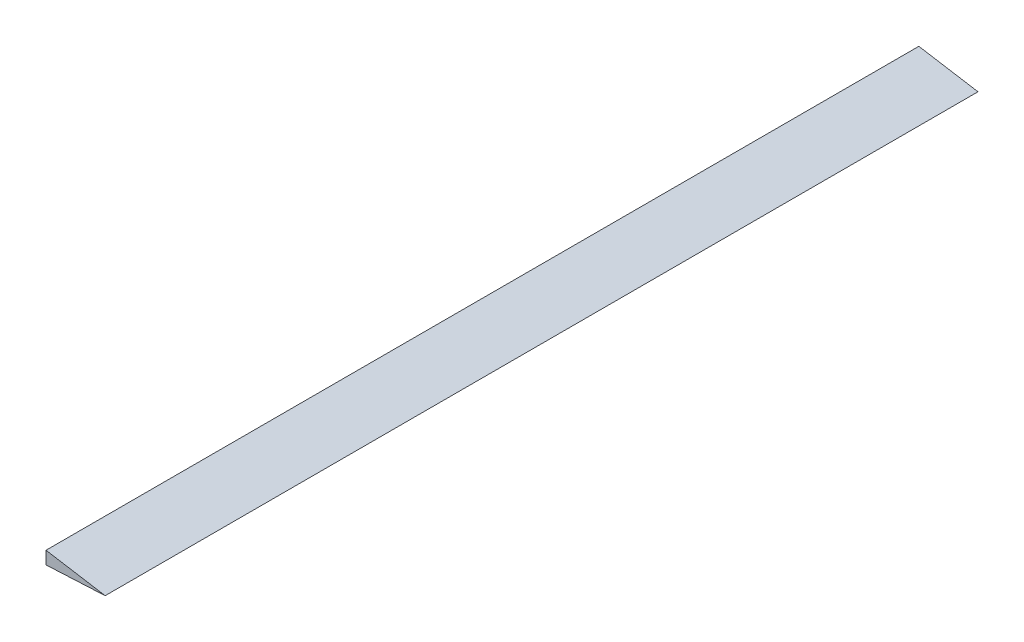
ISO-10303-21;
HEADER;
FILE_DESCRIPTION(('STEP AP214'),'2;1');
FILE_NAME('part.step','',(''),(''),'','','');
FILE_SCHEMA(('AUTOMOTIVE_DESIGN { 1 0 10303 214 1 1 1 1 }'));
ENDSEC;
DATA;
#1=APPLICATION_CONTEXT('core data for automotive mechanical design processes');
#2=APPLICATION_PROTOCOL_DEFINITION('international standard','automotive_design',2000,#1);
#3=PRODUCT_CONTEXT('',#1,'mechanical');
#4=PRODUCT('Part','Part','',(#3));
#5=PRODUCT_RELATED_PRODUCT_CATEGORY('part','',(#4));
#6=PRODUCT_DEFINITION_FORMATION('','',#4);
#7=PRODUCT_DEFINITION_CONTEXT('part definition',#1,'design');
#8=PRODUCT_DEFINITION('design','',#6,#7);
#9=PRODUCT_DEFINITION_SHAPE('','',#8);
#10=(LENGTH_UNIT() NAMED_UNIT(*) SI_UNIT(.MILLI.,.METRE.));
#11=(NAMED_UNIT(*) PLANE_ANGLE_UNIT() SI_UNIT($,.RADIAN.));
#12=(NAMED_UNIT(*) SI_UNIT($,.STERADIAN.) SOLID_ANGLE_UNIT());
#13=UNCERTAINTY_MEASURE_WITH_UNIT(LENGTH_MEASURE(1.E-05),#10,'distance_accuracy_value','');
#14=(GEOMETRIC_REPRESENTATION_CONTEXT(3) GLOBAL_UNCERTAINTY_ASSIGNED_CONTEXT((#13)) GLOBAL_UNIT_ASSIGNED_CONTEXT((#10,
#11,#12)) REPRESENTATION_CONTEXT('',''));
#15=CARTESIAN_POINT('',(0.,0.,0.));
#16=DIRECTION('',(0.,0.,1.));
#17=DIRECTION('',(1.,0.,0.));
#18=AXIS2_PLACEMENT_3D('',#15,#16,#17);
#19=CARTESIAN_POINT('',(274.102693551203,-2.52577255380021,-39.261541819769));
#20=DIRECTION('',(0.0496585902517502,-0.998766251138978,0.));
#21=DIRECTION('',(0.998766251138979,0.0496585902517502,0.));
#22=AXIS2_PLACEMENT_3D('',#19,#20,#21);
#23=PLANE('',#22);
#24=DIRECTION('',(0.998766251138978,0.0496585902517502,0.));
#25=VECTOR('',#24,1.);
#26=CARTESIAN_POINT('',(274.102693551203,-2.52577255380021,12.6999999999999));
#27=LINE('',#26,#25);
#28=CARTESIAN_POINT('',(274.102693551203,-2.52577255380021,12.6999999999999));
#29=VERTEX_POINT('',#28);
#30=CARTESIAN_POINT('',(324.9026935512,0.,12.6999999999999));
#31=VERTEX_POINT('',#30);
#32=EDGE_CURVE('E46',#29,#31,#27,.T.);
#33=ORIENTED_EDGE('',*,*,#32,.T.);
#34=DIRECTION('',(0.,0.,1.));
#35=VECTOR('',#34,1.);
#36=CARTESIAN_POINT('',(324.9026935512,0.,-39.261541819769));
#37=LINE('',#36,#35);
#38=CARTESIAN_POINT('',(324.9026935512,0.,761.999746));
#39=VERTEX_POINT('',#38);
#40=EDGE_CURVE('E86',#31,#39,#37,.T.);
#41=ORIENTED_EDGE('',*,*,#40,.T.);
#42=DIRECTION('',(-0.998766251138978,-0.0496585902517502,0.));
#43=VECTOR('',#42,1.);
#44=CARTESIAN_POINT('',(274.102693551203,-2.52577255380021,761.999746));
#45=LINE('',#44,#43);
#46=CARTESIAN_POINT('',(274.102693551203,-2.52577255380021,761.999746));
#47=VERTEX_POINT('',#46);
#48=EDGE_CURVE('E76',#39,#47,#45,.T.);
#49=ORIENTED_EDGE('',*,*,#48,.T.);
#50=DIRECTION('',(0.,0.,1.));
#51=VECTOR('',#50,1.);
#52=CARTESIAN_POINT('',(274.102693551203,-2.52577255380021,-39.261541819769));
#53=LINE('',#52,#51);
#54=EDGE_CURVE('E81',#29,#47,#53,.T.);
#55=ORIENTED_EDGE('',*,*,#54,.F.);
#56=EDGE_LOOP('',(#33,#41,#49,#55));
#57=FACE_BOUND('',#56,.T.);
#58=ADVANCED_FACE('F39',(#57),#23,.T.);
#59=CARTESIAN_POINT('',(274.1026935512,8.39951134583515,-39.261541819769));
#60=DIRECTION('',(0.163129854151705,0.986604607066298,0.));
#61=DIRECTION('',(-0.986604607066298,0.163129854151705,0.));
#62=AXIS2_PLACEMENT_3D('',#59,#60,#61);
#63=PLANE('',#62);
#64=DIRECTION('',(-0.986604607066298,0.163129854151705,0.));
#65=VECTOR('',#64,1.);
#66=CARTESIAN_POINT('',(274.1026935512,8.39951134583515,12.6999999999999));
#67=LINE('',#66,#65);
#68=CARTESIAN_POINT('',(274.1026935512,8.39951134583515,12.6999999999999));
#69=VERTEX_POINT('',#68);
#70=EDGE_CURVE('E53',#31,#69,#67,.T.);
#71=ORIENTED_EDGE('',*,*,#70,.T.);
#72=DIRECTION('',(0.,0.,1.));
#73=VECTOR('',#72,1.);
#74=CARTESIAN_POINT('',(274.1026935512,8.39951134583515,-39.261541819769));
#75=LINE('',#74,#73);
#76=CARTESIAN_POINT('',(274.1026935512,8.39951134583515,761.999746));
#77=VERTEX_POINT('',#76);
#78=EDGE_CURVE('E85',#69,#77,#75,.T.);
#79=ORIENTED_EDGE('',*,*,#78,.T.);
#80=DIRECTION('',(0.986604607066297,-0.163129854151705,0.));
#81=VECTOR('',#80,1.);
#82=CARTESIAN_POINT('',(274.1026935512,8.39951134583515,761.999746));
#83=LINE('',#82,#81);
#84=EDGE_CURVE('E78',#77,#39,#83,.T.);
#85=ORIENTED_EDGE('',*,*,#84,.T.);
#86=ORIENTED_EDGE('',*,*,#40,.F.);
#87=EDGE_LOOP('',(#71,#79,#85,#86));
#88=FACE_BOUND('',#87,.T.);
#89=ADVANCED_FACE('F94',(#88),#63,.T.);
#90=CARTESIAN_POINT('',(274.102693551203,-2.52577255380021,-39.261541819769));
#91=DIRECTION('',(-1.,-2.64210970675256E-13,0.));
#92=DIRECTION('',(2.64210970675256E-13,-1.,0.));
#93=AXIS2_PLACEMENT_3D('',#90,#91,#92);
#94=PLANE('',#93);
#95=DIRECTION('',(2.64210970675256E-13,-1.,0.));
#96=VECTOR('',#95,1.);
#97=CARTESIAN_POINT('',(274.102693551203,-2.52577255380021,12.6999999999999));
#98=LINE('',#97,#96);
#99=EDGE_CURVE('E11',#69,#29,#98,.T.);
#100=ORIENTED_EDGE('',*,*,#99,.T.);
#101=ORIENTED_EDGE('',*,*,#54,.T.);
#102=DIRECTION('',(-2.64210970675256E-13,1.,0.));
#103=VECTOR('',#102,1.);
#104=CARTESIAN_POINT('',(274.102693551203,-2.52577255380021,761.999746));
#105=LINE('',#104,#103);
#106=EDGE_CURVE('E73',#47,#77,#105,.T.);
#107=ORIENTED_EDGE('',*,*,#106,.T.);
#108=ORIENTED_EDGE('',*,*,#78,.F.);
#109=EDGE_LOOP('',(#100,#101,#107,#108));
#110=FACE_BOUND('',#109,.T.);
#111=ADVANCED_FACE('F82',(#110),#94,.T.);
#112=CARTESIAN_POINT('',(0.,0.,761.999746));
#113=DIRECTION('',(0.,0.,-1.));
#114=DIRECTION('',(1.,0.,0.));
#115=AXIS2_PLACEMENT_3D('',#112,#113,#114);
#116=PLANE('',#115);
#117=ORIENTED_EDGE('',*,*,#48,.F.);
#118=ORIENTED_EDGE('',*,*,#84,.F.);
#119=ORIENTED_EDGE('',*,*,#106,.F.);
#120=EDGE_LOOP('',(#117,#118,#119));
#121=FACE_BOUND('',#120,.T.);
#122=ADVANCED_FACE('F74',(#121),#116,.F.);
#123=CARTESIAN_POINT('',(1.1516545592317,2.60088125935345,12.6999999999999));
#124=DIRECTION('',(0.,0.,1.));
#125=DIRECTION('',(-1.,0.,0.));
#126=AXIS2_PLACEMENT_3D('',#123,#124,#125);
#127=PLANE('',#126);
#128=ORIENTED_EDGE('',*,*,#32,.F.);
#129=ORIENTED_EDGE('',*,*,#99,.F.);
#130=ORIENTED_EDGE('',*,*,#70,.F.);
#131=EDGE_LOOP('',(#128,#129,#130));
#132=FACE_BOUND('',#131,.T.);
#133=ADVANCED_FACE('F95',(#132),#127,.F.);
#134=CLOSED_SHELL('',(#58,#89,#111,#122,#133));
#135=MANIFOLD_SOLID_BREP('B2',#134);
#136=ADVANCED_BREP_SHAPE_REPRESENTATION('',(#18,#135),#14);
#137=SHAPE_DEFINITION_REPRESENTATION(#9,#136);
ENDSEC;
END-ISO-10303-21;
